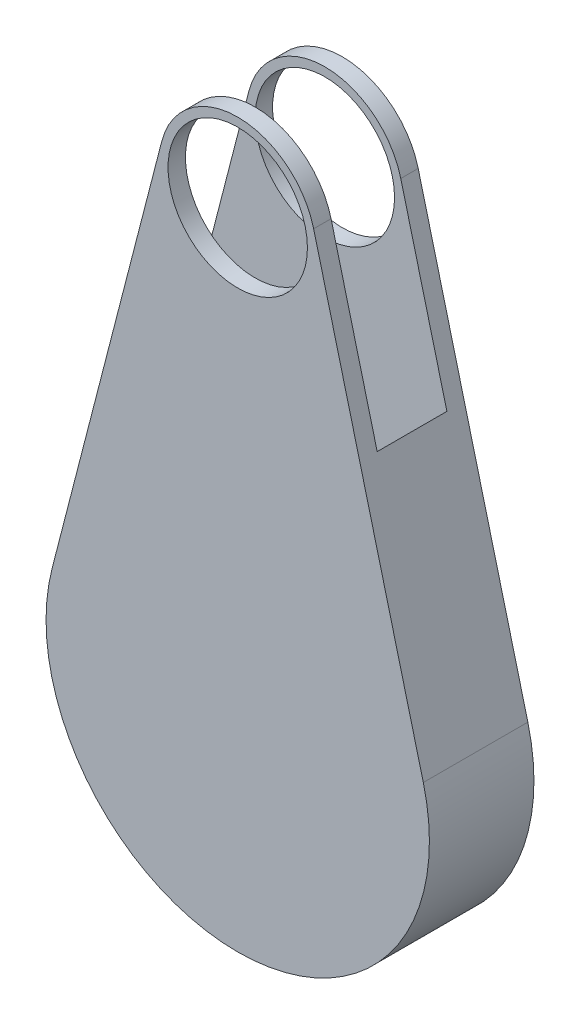
ISO-10303-21;
HEADER;
FILE_DESCRIPTION(('STEP AP214'),'2;1');
FILE_NAME('part.step','',(''),(''),'','','');
FILE_SCHEMA(('AUTOMOTIVE_DESIGN { 1 0 10303 214 1 1 1 1 }'));
ENDSEC;
DATA;
#1=APPLICATION_CONTEXT('core data for automotive mechanical design processes');
#2=APPLICATION_PROTOCOL_DEFINITION('international standard','automotive_design',2000,#1);
#3=PRODUCT_CONTEXT('',#1,'mechanical');
#4=PRODUCT('Part','Part','',(#3));
#5=PRODUCT_RELATED_PRODUCT_CATEGORY('part','',(#4));
#6=PRODUCT_DEFINITION_FORMATION('','',#4);
#7=PRODUCT_DEFINITION_CONTEXT('part definition',#1,'design');
#8=PRODUCT_DEFINITION('design','',#6,#7);
#9=PRODUCT_DEFINITION_SHAPE('','',#8);
#10=(LENGTH_UNIT() NAMED_UNIT(*) SI_UNIT(.MILLI.,.METRE.));
#11=(NAMED_UNIT(*) PLANE_ANGLE_UNIT() SI_UNIT($,.RADIAN.));
#12=(NAMED_UNIT(*) SI_UNIT($,.STERADIAN.) SOLID_ANGLE_UNIT());
#13=UNCERTAINTY_MEASURE_WITH_UNIT(LENGTH_MEASURE(1.E-05),#10,'distance_accuracy_value','');
#14=(GEOMETRIC_REPRESENTATION_CONTEXT(3) GLOBAL_UNCERTAINTY_ASSIGNED_CONTEXT((#13)) GLOBAL_UNIT_ASSIGNED_CONTEXT((#10,
#11,#12)) REPRESENTATION_CONTEXT('',''));
#15=CARTESIAN_POINT('',(0.,0.,0.));
#16=DIRECTION('',(0.,0.,1.));
#17=DIRECTION('',(1.,0.,0.));
#18=AXIS2_PLACEMENT_3D('',#15,#16,#17);
#19=CARTESIAN_POINT('',(21.7855313224167,135.625,15.));
#20=DIRECTION('',(-0.968245836551854,-0.25,0.));
#21=DIRECTION('',(0.25,-0.968245836551854,0.));
#22=AXIS2_PLACEMENT_3D('',#19,#20,#21);
#23=PLANE('',#22);
#24=DIRECTION('',(-0.25,0.968245836551854,0.));
#25=VECTOR('',#24,1.);
#26=CARTESIAN_POINT('',(35.0201742215307,84.3674484587292,-10.));
#27=LINE('',#26,#25);
#28=CARTESIAN_POINT('',(35.0201742215307,84.3674484587292,-10.));
#29=VERTEX_POINT('',#28);
#30=CARTESIAN_POINT('',(21.7855313224167,135.625,-10.));
#31=VERTEX_POINT('',#30);
#32=EDGE_CURVE('E128',#29,#31,#27,.T.);
#33=ORIENTED_EDGE('',*,*,#32,.F.);
#34=DIRECTION('',(0.,0.,1.));
#35=VECTOR('',#34,1.);
#36=CARTESIAN_POINT('',(35.0201742215307,84.3674484587292,-10.));
#37=LINE('',#36,#35);
#38=CARTESIAN_POINT('',(35.0201742215307,84.3674484587292,10.));
#39=VERTEX_POINT('',#38);
#40=EDGE_CURVE('E160',#29,#39,#37,.T.);
#41=ORIENTED_EDGE('',*,*,#40,.T.);
#42=DIRECTION('',(-0.25,0.968245836551854,0.));
#43=VECTOR('',#42,1.);
#44=CARTESIAN_POINT('',(35.0201742215307,84.3674484587292,10.));
#45=LINE('',#44,#43);
#46=CARTESIAN_POINT('',(21.7855313224167,135.625,10.));
#47=VERTEX_POINT('',#46);
#48=EDGE_CURVE('E132',#39,#47,#45,.T.);
#49=ORIENTED_EDGE('',*,*,#48,.T.);
#50=DIRECTION('',(0.,0.,-1.));
#51=VECTOR('',#50,1.);
#52=CARTESIAN_POINT('',(21.7855313224167,135.625,15.));
#53=LINE('',#52,#51);
#54=CARTESIAN_POINT('',(21.7855313224167,135.625,15.));
#55=VERTEX_POINT('',#54);
#56=EDGE_CURVE('E54',#55,#47,#53,.T.);
#57=ORIENTED_EDGE('',*,*,#56,.F.);
#58=DIRECTION('',(-0.25,0.968245836551854,0.));
#59=VECTOR('',#58,1.);
#60=CARTESIAN_POINT('',(21.7855313224167,135.625,15.));
#61=LINE('',#60,#59);
#62=CARTESIAN_POINT('',(53.253521010352,13.75,15.));
#63=VERTEX_POINT('',#62);
#64=EDGE_CURVE('E98',#63,#55,#61,.T.);
#65=ORIENTED_EDGE('',*,*,#64,.F.);
#66=DIRECTION('',(0.,0.,-1.));
#67=VECTOR('',#66,1.);
#68=CARTESIAN_POINT('',(53.253521010352,13.75,15.));
#69=LINE('',#68,#67);
#70=CARTESIAN_POINT('',(53.253521010352,13.75,-15.));
#71=VERTEX_POINT('',#70);
#72=EDGE_CURVE('E11',#63,#71,#69,.T.);
#73=ORIENTED_EDGE('',*,*,#72,.T.);
#74=DIRECTION('',(-0.25,0.968245836551854,0.));
#75=VECTOR('',#74,1.);
#76=CARTESIAN_POINT('',(21.7855313224167,135.625,-15.));
#77=LINE('',#76,#75);
#78=CARTESIAN_POINT('',(21.7855313224167,135.625,-15.));
#79=VERTEX_POINT('',#78);
#80=EDGE_CURVE('E181',#71,#79,#77,.T.);
#81=ORIENTED_EDGE('',*,*,#80,.T.);
#82=EDGE_CURVE('E148',#31,#79,#53,.T.);
#83=ORIENTED_EDGE('',*,*,#82,.F.);
#84=EDGE_LOOP('',(#33,#41,#49,#57,#65,#73,#81,#83));
#85=FACE_BOUND('',#84,.T.);
#86=ADVANCED_FACE('F45',(#85),#23,.F.);
#87=CARTESIAN_POINT('',(0.,130.,15.));
#88=DIRECTION('',(0.,0.,-1.));
#89=DIRECTION('',(-1.,0.,0.));
#90=AXIS2_PLACEMENT_3D('',#87,#88,#89);
#91=CYLINDRICAL_SURFACE('',#90,22.5);
#92=CARTESIAN_POINT('',(0.,130.,-10.));
#93=DIRECTION('',(0.,0.,1.));
#94=DIRECTION('',(1.,0.,0.));
#95=AXIS2_PLACEMENT_3D('',#92,#93,#94);
#96=CIRCLE('',#95,22.5);
#97=CARTESIAN_POINT('',(-21.7855313224167,135.625,-10.));
#98=VERTEX_POINT('',#97);
#99=EDGE_CURVE('E120',#31,#98,#96,.T.);
#100=ORIENTED_EDGE('',*,*,#99,.F.);
#101=ORIENTED_EDGE('',*,*,#82,.T.);
#102=CARTESIAN_POINT('',(0.,130.,-15.));
#103=DIRECTION('',(0.,0.,1.));
#104=DIRECTION('',(1.,0.,0.));
#105=AXIS2_PLACEMENT_3D('',#102,#103,#104);
#106=CIRCLE('',#105,22.5);
#107=CARTESIAN_POINT('',(-21.7855313224167,135.625,-15.));
#108=VERTEX_POINT('',#107);
#109=EDGE_CURVE('E143',#79,#108,#106,.T.);
#110=ORIENTED_EDGE('',*,*,#109,.T.);
#111=DIRECTION('',(0.,0.,-1.));
#112=VECTOR('',#111,1.);
#113=CARTESIAN_POINT('',(-21.7855313224167,135.625,15.));
#114=LINE('',#113,#112);
#115=EDGE_CURVE('E135',#98,#108,#114,.T.);
#116=ORIENTED_EDGE('',*,*,#115,.F.);
#117=EDGE_LOOP('',(#100,#101,#110,#116));
#118=FACE_BOUND('',#117,.T.);
#119=ADVANCED_FACE('F141',(#118),#91,.T.);
#120=CARTESIAN_POINT('',(-53.253521010352,13.75,15.));
#121=DIRECTION('',(0.968245836551854,-0.25,0.));
#122=DIRECTION('',(0.25,0.968245836551854,0.));
#123=AXIS2_PLACEMENT_3D('',#120,#121,#122);
#124=PLANE('',#123);
#125=DIRECTION('',(-0.25,-0.968245836551854,0.));
#126=VECTOR('',#125,1.);
#127=CARTESIAN_POINT('',(-21.7855313224167,135.625,-10.));
#128=LINE('',#127,#126);
#129=CARTESIAN_POINT('',(-35.0201742215307,84.3674484587292,-10.));
#130=VERTEX_POINT('',#129);
#131=EDGE_CURVE('E125',#98,#130,#128,.T.);
#132=ORIENTED_EDGE('',*,*,#131,.F.);
#133=ORIENTED_EDGE('',*,*,#115,.T.);
#134=DIRECTION('',(-0.25,-0.968245836551854,0.));
#135=VECTOR('',#134,1.);
#136=CARTESIAN_POINT('',(-53.253521010352,13.75,-15.));
#137=LINE('',#136,#135);
#138=CARTESIAN_POINT('',(-53.253521010352,13.75,-15.));
#139=VERTEX_POINT('',#138);
#140=EDGE_CURVE('E91',#108,#139,#137,.T.);
#141=ORIENTED_EDGE('',*,*,#140,.T.);
#142=DIRECTION('',(0.,0.,-1.));
#143=VECTOR('',#142,1.);
#144=CARTESIAN_POINT('',(-53.253521010352,13.75,15.));
#145=LINE('',#144,#143);
#146=CARTESIAN_POINT('',(-53.253521010352,13.75,15.));
#147=VERTEX_POINT('',#146);
#148=EDGE_CURVE('E145',#147,#139,#145,.T.);
#149=ORIENTED_EDGE('',*,*,#148,.F.);
#150=DIRECTION('',(-0.25,-0.968245836551854,0.));
#151=VECTOR('',#150,1.);
#152=CARTESIAN_POINT('',(-53.253521010352,13.75,15.));
#153=LINE('',#152,#151);
#154=CARTESIAN_POINT('',(-21.7855313224167,135.625,15.));
#155=VERTEX_POINT('',#154);
#156=EDGE_CURVE('E71',#155,#147,#153,.T.);
#157=ORIENTED_EDGE('',*,*,#156,.F.);
#158=CARTESIAN_POINT('',(-21.7855313224167,135.625,10.));
#159=VERTEX_POINT('',#158);
#160=EDGE_CURVE('E144',#155,#159,#114,.T.);
#161=ORIENTED_EDGE('',*,*,#160,.T.);
#162=DIRECTION('',(-0.25,-0.968245836551854,0.));
#163=VECTOR('',#162,1.);
#164=CARTESIAN_POINT('',(-21.7855313224167,135.625,10.));
#165=LINE('',#164,#163);
#166=CARTESIAN_POINT('',(-35.0201742215307,84.3674484587292,10.));
#167=VERTEX_POINT('',#166);
#168=EDGE_CURVE('E191',#159,#167,#165,.T.);
#169=ORIENTED_EDGE('',*,*,#168,.T.);
#170=DIRECTION('',(0.,0.,1.));
#171=VECTOR('',#170,1.);
#172=CARTESIAN_POINT('',(-35.0201742215307,84.3674484587292,-10.));
#173=LINE('',#172,#171);
#174=EDGE_CURVE('E138',#130,#167,#173,.T.);
#175=ORIENTED_EDGE('',*,*,#174,.F.);
#176=EDGE_LOOP('',(#132,#133,#141,#149,#157,#161,#169,#175));
#177=FACE_BOUND('',#176,.T.);
#178=ADVANCED_FACE('F134',(#177),#124,.F.);
#179=CARTESIAN_POINT('',(0.,130.,-30.));
#180=DIRECTION('',(0.,0.,1.));
#181=DIRECTION('',(1.,0.,0.));
#182=AXIS2_PLACEMENT_3D('',#179,#180,#181);
#183=CYLINDRICAL_SURFACE('',#182,20.);
#184=CARTESIAN_POINT('',(0.,130.,-15.));
#185=DIRECTION('',(0.,0.,1.));
#186=DIRECTION('',(1.,0.,0.));
#187=AXIS2_PLACEMENT_3D('',#184,#185,#186);
#188=CIRCLE('',#187,20.);
#189=CARTESIAN_POINT('',(20.,130.,-15.));
#190=VERTEX_POINT('',#189);
#191=EDGE_CURVE('E154',#190,#190,#188,.T.);
#192=ORIENTED_EDGE('',*,*,#191,.F.);
#193=EDGE_LOOP('',(#192));
#194=FACE_BOUND('',#193,.T.);
#195=CARTESIAN_POINT('',(0.,130.,-10.));
#196=DIRECTION('',(0.,0.,1.));
#197=DIRECTION('',(1.,0.,0.));
#198=AXIS2_PLACEMENT_3D('',#195,#196,#197);
#199=CIRCLE('',#198,20.);
#200=CARTESIAN_POINT('',(20.,130.,-10.));
#201=VERTEX_POINT('',#200);
#202=EDGE_CURVE('E49',#201,#201,#199,.F.);
#203=ORIENTED_EDGE('',*,*,#202,.F.);
#204=EDGE_LOOP('',(#203));
#205=FACE_BOUND('',#204,.T.);
#206=ADVANCED_FACE('F225',(#194,#205),#183,.F.);
#207=CARTESIAN_POINT('',(0.,0.,15.));
#208=DIRECTION('',(0.,0.,-1.));
#209=DIRECTION('',(-1.,0.,0.));
#210=AXIS2_PLACEMENT_3D('',#207,#208,#209);
#211=CYLINDRICAL_SURFACE('',#210,55.);
#212=CARTESIAN_POINT('',(0.,0.,-15.));
#213=DIRECTION('',(0.,0.,1.));
#214=DIRECTION('',(1.,0.,0.));
#215=AXIS2_PLACEMENT_3D('',#212,#213,#214);
#216=CIRCLE('',#215,55.);
#217=EDGE_CURVE('E156',#139,#71,#216,.T.);
#218=ORIENTED_EDGE('',*,*,#217,.T.);
#219=ORIENTED_EDGE('',*,*,#72,.F.);
#220=CARTESIAN_POINT('',(0.,0.,15.));
#221=DIRECTION('',(0.,0.,1.));
#222=DIRECTION('',(1.,0.,0.));
#223=AXIS2_PLACEMENT_3D('',#220,#221,#222);
#224=CIRCLE('',#223,55.);
#225=EDGE_CURVE('E173',#147,#63,#224,.T.);
#226=ORIENTED_EDGE('',*,*,#225,.F.);
#227=ORIENTED_EDGE('',*,*,#148,.T.);
#228=EDGE_LOOP('',(#218,#219,#226,#227));
#229=FACE_BOUND('',#228,.T.);
#230=ADVANCED_FACE('F47',(#229),#211,.T.);
#231=ORIENTED_EDGE('',*,*,#56,.T.);
#232=CARTESIAN_POINT('',(0.,130.,10.));
#233=DIRECTION('',(0.,0.,1.));
#234=DIRECTION('',(1.,0.,0.));
#235=AXIS2_PLACEMENT_3D('',#232,#233,#234);
#236=CIRCLE('',#235,22.5);
#237=EDGE_CURVE('E196',#47,#159,#236,.T.);
#238=ORIENTED_EDGE('',*,*,#237,.T.);
#239=ORIENTED_EDGE('',*,*,#160,.F.);
#240=CARTESIAN_POINT('',(0.,130.,15.));
#241=DIRECTION('',(0.,0.,1.));
#242=DIRECTION('',(1.,0.,0.));
#243=AXIS2_PLACEMENT_3D('',#240,#241,#242);
#244=CIRCLE('',#243,22.5);
#245=EDGE_CURVE('E176',#55,#155,#244,.T.);
#246=ORIENTED_EDGE('',*,*,#245,.F.);
#247=EDGE_LOOP('',(#231,#238,#239,#246));
#248=FACE_BOUND('',#247,.T.);
#249=ADVANCED_FACE('F195',(#248),#91,.T.);
#250=CARTESIAN_POINT('',(0.,0.,15.));
#251=DIRECTION('',(0.,0.,1.));
#252=DIRECTION('',(1.,0.,0.));
#253=AXIS2_PLACEMENT_3D('',#250,#251,#252);
#254=PLANE('',#253);
#255=CARTESIAN_POINT('',(0.,130.,15.));
#256=DIRECTION('',(0.,0.,1.));
#257=DIRECTION('',(1.,0.,0.));
#258=AXIS2_PLACEMENT_3D('',#255,#256,#257);
#259=CIRCLE('',#258,20.);
#260=CARTESIAN_POINT('',(20.,130.,15.));
#261=VERTEX_POINT('',#260);
#262=EDGE_CURVE('E157',#261,#261,#259,.T.);
#263=ORIENTED_EDGE('',*,*,#262,.F.);
#264=EDGE_LOOP('',(#263));
#265=FACE_BOUND('',#264,.T.);
#266=ORIENTED_EDGE('',*,*,#225,.T.);
#267=ORIENTED_EDGE('',*,*,#64,.T.);
#268=ORIENTED_EDGE('',*,*,#245,.T.);
#269=ORIENTED_EDGE('',*,*,#156,.T.);
#270=EDGE_LOOP('',(#266,#267,#268,#269));
#271=FACE_BOUND('',#270,.T.);
#272=ADVANCED_FACE('F222',(#265,#271),#254,.T.);
#273=CARTESIAN_POINT('',(0.,0.,-15.));
#274=DIRECTION('',(0.,0.,1.));
#275=DIRECTION('',(1.,0.,0.));
#276=AXIS2_PLACEMENT_3D('',#273,#274,#275);
#277=PLANE('',#276);
#278=ORIENTED_EDGE('',*,*,#191,.T.);
#279=EDGE_LOOP('',(#278));
#280=FACE_BOUND('',#279,.T.);
#281=ORIENTED_EDGE('',*,*,#217,.F.);
#282=ORIENTED_EDGE('',*,*,#140,.F.);
#283=ORIENTED_EDGE('',*,*,#109,.F.);
#284=ORIENTED_EDGE('',*,*,#80,.F.);
#285=EDGE_LOOP('',(#281,#282,#283,#284));
#286=FACE_BOUND('',#285,.T.);
#287=ADVANCED_FACE('F187',(#280,#286),#277,.F.);
#288=CARTESIAN_POINT('',(0.,130.,10.));
#289=DIRECTION('',(0.,0.,1.));
#290=DIRECTION('',(1.,0.,0.));
#291=AXIS2_PLACEMENT_3D('',#288,#289,#290);
#292=CIRCLE('',#291,20.);
#293=CARTESIAN_POINT('',(20.,130.,10.));
#294=VERTEX_POINT('',#293);
#295=EDGE_CURVE('E158',#294,#294,#292,.F.);
#296=ORIENTED_EDGE('',*,*,#295,.T.);
#297=EDGE_LOOP('',(#296));
#298=FACE_BOUND('',#297,.T.);
#299=ORIENTED_EDGE('',*,*,#262,.T.);
#300=EDGE_LOOP('',(#299));
#301=FACE_BOUND('',#300,.T.);
#302=ADVANCED_FACE('F212',(#298,#301),#183,.F.);
#303=CARTESIAN_POINT('',(0.,130.,-10.));
#304=DIRECTION('',(0.,0.,1.));
#305=DIRECTION('',(1.,0.,0.));
#306=AXIS2_PLACEMENT_3D('',#303,#304,#305);
#307=PLANE('',#306);
#308=ORIENTED_EDGE('',*,*,#99,.T.);
#309=ORIENTED_EDGE('',*,*,#131,.T.);
#310=CARTESIAN_POINT('',(0.,89.1870132729764,-10.));
#311=DIRECTION('',(0.,0.,1.));
#312=DIRECTION('',(1.,0.,0.));
#313=AXIS2_PLACEMENT_3D('',#310,#311,#312);
#314=CIRCLE('',#313,35.3502589453754);
#315=EDGE_CURVE('E139',#130,#29,#314,.T.);
#316=ORIENTED_EDGE('',*,*,#315,.T.);
#317=ORIENTED_EDGE('',*,*,#32,.T.);
#318=EDGE_LOOP('',(#308,#309,#316,#317));
#319=FACE_BOUND('',#318,.T.);
#320=ORIENTED_EDGE('',*,*,#202,.T.);
#321=EDGE_LOOP('',(#320));
#322=FACE_BOUND('',#321,.T.);
#323=ADVANCED_FACE('F122',(#319,#322),#307,.T.);
#324=CARTESIAN_POINT('',(0.,130.,10.));
#325=DIRECTION('',(0.,0.,1.));
#326=DIRECTION('',(1.,0.,0.));
#327=AXIS2_PLACEMENT_3D('',#324,#325,#326);
#328=PLANE('',#327);
#329=ORIENTED_EDGE('',*,*,#237,.F.);
#330=ORIENTED_EDGE('',*,*,#48,.F.);
#331=CARTESIAN_POINT('',(0.,89.1870132729764,10.));
#332=DIRECTION('',(0.,0.,1.));
#333=DIRECTION('',(1.,0.,0.));
#334=AXIS2_PLACEMENT_3D('',#331,#332,#333);
#335=CIRCLE('',#334,35.3502589453754);
#336=EDGE_CURVE('E62',#167,#39,#335,.T.);
#337=ORIENTED_EDGE('',*,*,#336,.F.);
#338=ORIENTED_EDGE('',*,*,#168,.F.);
#339=EDGE_LOOP('',(#329,#330,#337,#338));
#340=FACE_BOUND('',#339,.T.);
#341=ORIENTED_EDGE('',*,*,#295,.F.);
#342=EDGE_LOOP('',(#341));
#343=FACE_BOUND('',#342,.T.);
#344=ADVANCED_FACE('F202',(#340,#343),#328,.F.);
#345=CARTESIAN_POINT('',(0.,89.1870132729764,-10.));
#346=DIRECTION('',(0.,0.,1.));
#347=DIRECTION('',(1.,0.,0.));
#348=AXIS2_PLACEMENT_3D('',#345,#346,#347);
#349=CYLINDRICAL_SURFACE('',#348,35.3502589453754);
#350=ORIENTED_EDGE('',*,*,#336,.T.);
#351=ORIENTED_EDGE('',*,*,#40,.F.);
#352=ORIENTED_EDGE('',*,*,#315,.F.);
#353=ORIENTED_EDGE('',*,*,#174,.T.);
#354=EDGE_LOOP('',(#350,#351,#352,#353));
#355=FACE_BOUND('',#354,.T.);
#356=ADVANCED_FACE('F205',(#355),#349,.F.);
#357=CLOSED_SHELL('',(#86,#119,#178,#206,#230,#249,#272,#287,#302,#323,#344,#356));
#358=MANIFOLD_SOLID_BREP('B2',#357);
#359=ADVANCED_BREP_SHAPE_REPRESENTATION('',(#18,#358),#14);
#360=SHAPE_DEFINITION_REPRESENTATION(#9,#359);
ENDSEC;
END-ISO-10303-21;
